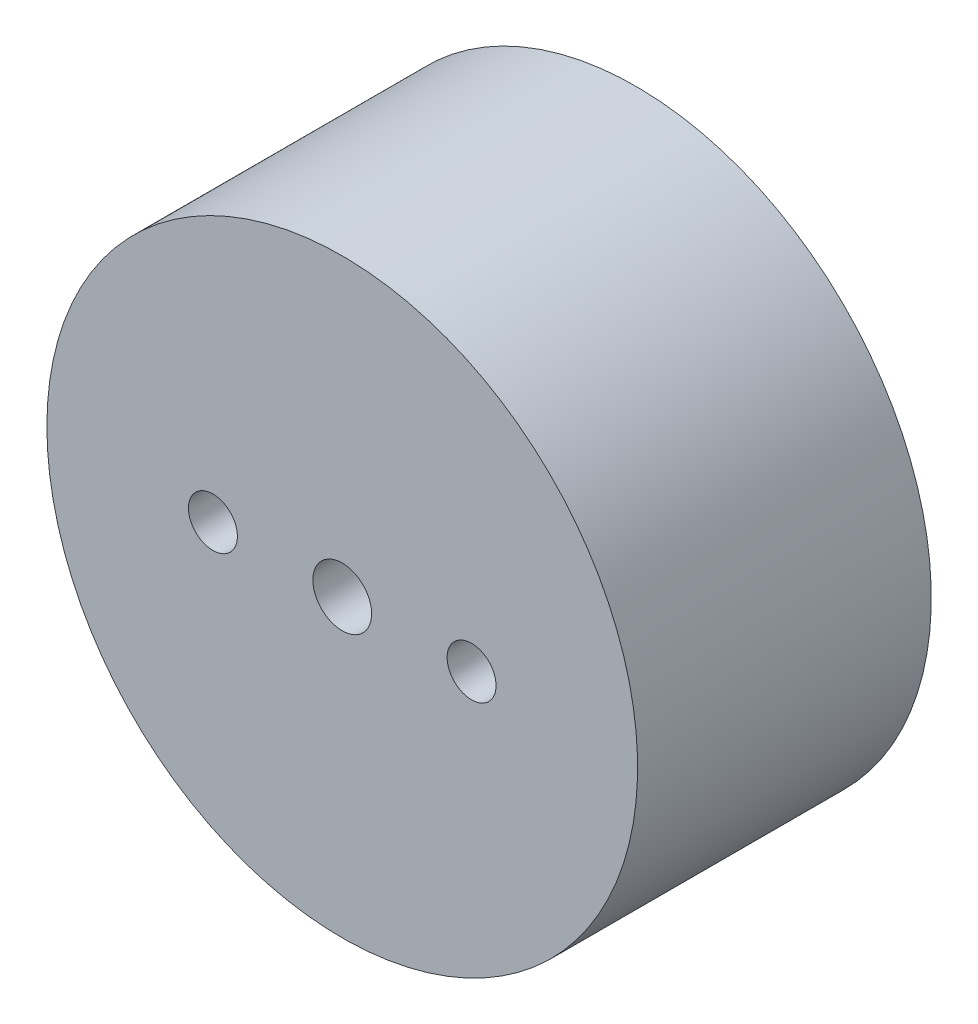
ISO-10303-21;
HEADER;
FILE_DESCRIPTION(('STEP AP214'),'2;1');
FILE_NAME('part.step','',(''),(''),'','','');
FILE_SCHEMA(('AUTOMOTIVE_DESIGN { 1 0 10303 214 1 1 1 1 }'));
ENDSEC;
DATA;
#1=APPLICATION_CONTEXT('core data for automotive mechanical design processes');
#2=APPLICATION_PROTOCOL_DEFINITION('international standard','automotive_design',2000,#1);
#3=PRODUCT_CONTEXT('',#1,'mechanical');
#4=PRODUCT('Part','Part','',(#3));
#5=PRODUCT_RELATED_PRODUCT_CATEGORY('part','',(#4));
#6=PRODUCT_DEFINITION_FORMATION('','',#4);
#7=PRODUCT_DEFINITION_CONTEXT('part definition',#1,'design');
#8=PRODUCT_DEFINITION('design','',#6,#7);
#9=PRODUCT_DEFINITION_SHAPE('','',#8);
#10=(LENGTH_UNIT() NAMED_UNIT(*) SI_UNIT(.MILLI.,.METRE.));
#11=(NAMED_UNIT(*) PLANE_ANGLE_UNIT() SI_UNIT($,.RADIAN.));
#12=(NAMED_UNIT(*) SI_UNIT($,.STERADIAN.) SOLID_ANGLE_UNIT());
#13=UNCERTAINTY_MEASURE_WITH_UNIT(LENGTH_MEASURE(1.E-05),#10,'distance_accuracy_value','');
#14=(GEOMETRIC_REPRESENTATION_CONTEXT(3) GLOBAL_UNCERTAINTY_ASSIGNED_CONTEXT((#13)) GLOBAL_UNIT_ASSIGNED_CONTEXT((#10,
#11,#12)) REPRESENTATION_CONTEXT('',''));
#15=CARTESIAN_POINT('',(0.,0.,0.));
#16=DIRECTION('',(0.,0.,1.));
#17=DIRECTION('',(1.,0.,0.));
#18=AXIS2_PLACEMENT_3D('',#15,#16,#17);
#19=CARTESIAN_POINT('',(0.,0.,-5.08));
#20=DIRECTION('',(0.,0.,1.));
#21=DIRECTION('',(1.,0.,0.));
#22=AXIS2_PLACEMENT_3D('',#19,#20,#21);
#23=PLANE('',#22);
#24=CARTESIAN_POINT('',(8.7249,0.,-5.08));
#25=DIRECTION('',(0.,0.,1.));
#26=DIRECTION('',(1.,0.,0.));
#27=AXIS2_PLACEMENT_3D('',#24,#25,#26);
#28=CIRCLE('',#27,1.651);
#29=CARTESIAN_POINT('',(10.3759,0.,-5.08));
#30=VERTEX_POINT('',#29);
#31=EDGE_CURVE('E40',#30,#30,#28,.T.);
#32=ORIENTED_EDGE('',*,*,#31,.T.);
#33=EDGE_LOOP('',(#32));
#34=FACE_BOUND('',#33,.T.);
#35=CARTESIAN_POINT('',(-8.7249,0.,-5.08));
#36=DIRECTION('',(0.,0.,1.));
#37=DIRECTION('',(1.,0.,0.));
#38=AXIS2_PLACEMENT_3D('',#35,#36,#37);
#39=CIRCLE('',#38,1.651);
#40=CARTESIAN_POINT('',(-7.0739,0.,-5.08));
#41=VERTEX_POINT('',#40);
#42=EDGE_CURVE('E43',#41,#41,#39,.T.);
#43=ORIENTED_EDGE('',*,*,#42,.T.);
#44=EDGE_LOOP('',(#43));
#45=FACE_BOUND('',#44,.T.);
#46=CARTESIAN_POINT('',(0.,0.,-5.08));
#47=DIRECTION('',(0.,0.,1.));
#48=DIRECTION('',(1.,0.,0.));
#49=AXIS2_PLACEMENT_3D('',#46,#47,#48);
#50=CIRCLE('',#49,1.9812);
#51=CARTESIAN_POINT('',(1.9812,0.,-5.08));
#52=VERTEX_POINT('',#51);
#53=EDGE_CURVE('E45',#52,#52,#50,.T.);
#54=ORIENTED_EDGE('',*,*,#53,.T.);
#55=EDGE_LOOP('',(#54));
#56=FACE_BOUND('',#55,.T.);
#57=CARTESIAN_POINT('',(0.,0.,-5.08));
#58=DIRECTION('',(0.,0.,-1.));
#59=DIRECTION('',(-1.,0.,0.));
#60=AXIS2_PLACEMENT_3D('',#57,#58,#59);
#61=CIRCLE('',#60,18.9455130456292);
#62=CARTESIAN_POINT('',(-18.9455130456292,0.,-5.08));
#63=VERTEX_POINT('',#62);
#64=EDGE_CURVE('E17',#63,#63,#61,.T.);
#65=ORIENTED_EDGE('',*,*,#64,.T.);
#66=EDGE_LOOP('',(#65));
#67=FACE_BOUND('',#66,.T.);
#68=ADVANCED_FACE('F14',(#34,#45,#56,#67),#23,.F.);
#69=CARTESIAN_POINT('',(0.,0.,-5.08));
#70=DIRECTION('',(0.,0.,-1.));
#71=DIRECTION('',(-1.,0.,0.));
#72=AXIS2_PLACEMENT_3D('',#69,#70,#71);
#73=CYLINDRICAL_SURFACE('',#72,18.9455130456292);
#74=ORIENTED_EDGE('',*,*,#64,.F.);
#75=EDGE_LOOP('',(#74));
#76=FACE_BOUND('',#75,.T.);
#77=CARTESIAN_POINT('',(0.,0.,-19.812));
#78=DIRECTION('',(0.,0.,-1.));
#79=DIRECTION('',(-1.,0.,0.));
#80=AXIS2_PLACEMENT_3D('',#77,#78,#79);
#81=CIRCLE('',#80,18.9455130456292);
#82=CARTESIAN_POINT('',(-18.9455130456292,0.,-19.812));
#83=VERTEX_POINT('',#82);
#84=EDGE_CURVE('E37',#83,#83,#81,.T.);
#85=ORIENTED_EDGE('',*,*,#84,.T.);
#86=EDGE_LOOP('',(#85));
#87=FACE_BOUND('',#86,.T.);
#88=ADVANCED_FACE('F53',(#76,#87),#73,.F.);
#89=CARTESIAN_POINT('',(0.,0.,-56.5885664557779));
#90=DIRECTION('',(0.,0.,1.));
#91=DIRECTION('',(1.,0.,0.));
#92=AXIS2_PLACEMENT_3D('',#89,#90,#91);
#93=CYLINDRICAL_SURFACE('',#92,1.9812);
#94=CARTESIAN_POINT('',(0.,0.,0.));
#95=DIRECTION('',(0.,0.,1.));
#96=DIRECTION('',(1.,0.,0.));
#97=AXIS2_PLACEMENT_3D('',#94,#95,#96);
#98=CIRCLE('',#97,1.9812);
#99=CARTESIAN_POINT('',(1.9812,0.,0.));
#100=VERTEX_POINT('',#99);
#101=EDGE_CURVE('E34',#100,#100,#98,.F.);
#102=ORIENTED_EDGE('',*,*,#101,.F.);
#103=EDGE_LOOP('',(#102));
#104=FACE_BOUND('',#103,.T.);
#105=ORIENTED_EDGE('',*,*,#53,.F.);
#106=EDGE_LOOP('',(#105));
#107=FACE_BOUND('',#106,.T.);
#108=ADVANCED_FACE('F56',(#104,#107),#93,.F.);
#109=CARTESIAN_POINT('',(-8.7249,0.,-56.5885664557779));
#110=DIRECTION('',(0.,0.,1.));
#111=DIRECTION('',(1.,0.,0.));
#112=AXIS2_PLACEMENT_3D('',#109,#110,#111);
#113=CYLINDRICAL_SURFACE('',#112,1.651);
#114=CARTESIAN_POINT('',(-8.7249,0.,0.));
#115=DIRECTION('',(0.,0.,1.));
#116=DIRECTION('',(1.,0.,0.));
#117=AXIS2_PLACEMENT_3D('',#114,#115,#116);
#118=CIRCLE('',#117,1.651);
#119=CARTESIAN_POINT('',(-7.0739,0.,0.));
#120=VERTEX_POINT('',#119);
#121=EDGE_CURVE('E31',#120,#120,#118,.F.);
#122=ORIENTED_EDGE('',*,*,#121,.F.);
#123=EDGE_LOOP('',(#122));
#124=FACE_BOUND('',#123,.T.);
#125=ORIENTED_EDGE('',*,*,#42,.F.);
#126=EDGE_LOOP('',(#125));
#127=FACE_BOUND('',#126,.T.);
#128=ADVANCED_FACE('F79',(#124,#127),#113,.F.);
#129=CARTESIAN_POINT('',(8.7249,0.,-56.5885664557779));
#130=DIRECTION('',(0.,0.,1.));
#131=DIRECTION('',(1.,0.,0.));
#132=AXIS2_PLACEMENT_3D('',#129,#130,#131);
#133=CYLINDRICAL_SURFACE('',#132,1.651);
#134=CARTESIAN_POINT('',(8.7249,0.,0.));
#135=DIRECTION('',(0.,0.,1.));
#136=DIRECTION('',(1.,0.,0.));
#137=AXIS2_PLACEMENT_3D('',#134,#135,#136);
#138=CIRCLE('',#137,1.651);
#139=CARTESIAN_POINT('',(10.3759,0.,0.));
#140=VERTEX_POINT('',#139);
#141=EDGE_CURVE('E26',#140,#140,#138,.F.);
#142=ORIENTED_EDGE('',*,*,#141,.F.);
#143=EDGE_LOOP('',(#142));
#144=FACE_BOUND('',#143,.T.);
#145=ORIENTED_EDGE('',*,*,#31,.F.);
#146=EDGE_LOOP('',(#145));
#147=FACE_BOUND('',#146,.T.);
#148=ADVANCED_FACE('F63',(#144,#147),#133,.F.);
#149=CARTESIAN_POINT('',(0.,0.,-19.812));
#150=DIRECTION('',(0.,0.,1.));
#151=DIRECTION('',(1.,0.,0.));
#152=AXIS2_PLACEMENT_3D('',#149,#150,#151);
#153=PLANE('',#152);
#154=ORIENTED_EDGE('',*,*,#84,.F.);
#155=EDGE_LOOP('',(#154));
#156=FACE_BOUND('',#155,.T.);
#157=CARTESIAN_POINT('',(0.,0.,-19.812));
#158=DIRECTION('',(0.,0.,-1.));
#159=DIRECTION('',(-1.,0.,0.));
#160=AXIS2_PLACEMENT_3D('',#157,#158,#159);
#161=CIRCLE('',#160,19.9263);
#162=CARTESIAN_POINT('',(-19.9263,0.,-19.812));
#163=VERTEX_POINT('',#162);
#164=EDGE_CURVE('E21',#163,#163,#161,.F.);
#165=ORIENTED_EDGE('',*,*,#164,.F.);
#166=EDGE_LOOP('',(#165));
#167=FACE_BOUND('',#166,.T.);
#168=ADVANCED_FACE('F59',(#156,#167),#153,.F.);
#169=CARTESIAN_POINT('',(0.,0.,0.));
#170=DIRECTION('',(0.,0.,1.));
#171=DIRECTION('',(1.,0.,0.));
#172=AXIS2_PLACEMENT_3D('',#169,#170,#171);
#173=PLANE('',#172);
#174=ORIENTED_EDGE('',*,*,#141,.T.);
#175=EDGE_LOOP('',(#174));
#176=FACE_BOUND('',#175,.T.);
#177=ORIENTED_EDGE('',*,*,#121,.T.);
#178=EDGE_LOOP('',(#177));
#179=FACE_BOUND('',#178,.T.);
#180=ORIENTED_EDGE('',*,*,#101,.T.);
#181=EDGE_LOOP('',(#180));
#182=FACE_BOUND('',#181,.T.);
#183=CARTESIAN_POINT('',(0.,0.,0.));
#184=DIRECTION('',(0.,0.,-1.));
#185=DIRECTION('',(-1.,0.,0.));
#186=AXIS2_PLACEMENT_3D('',#183,#184,#185);
#187=CIRCLE('',#186,19.9263);
#188=CARTESIAN_POINT('',(-19.9263,0.,0.));
#189=VERTEX_POINT('',#188);
#190=EDGE_CURVE('E10',#189,#189,#187,.T.);
#191=ORIENTED_EDGE('',*,*,#190,.F.);
#192=EDGE_LOOP('',(#191));
#193=FACE_BOUND('',#192,.T.);
#194=ADVANCED_FACE('F62',(#176,#179,#182,#193),#173,.T.);
#195=CARTESIAN_POINT('',(0.,0.,0.));
#196=DIRECTION('',(0.,0.,-1.));
#197=DIRECTION('',(-1.,0.,0.));
#198=AXIS2_PLACEMENT_3D('',#195,#196,#197);
#199=CYLINDRICAL_SURFACE('',#198,19.9263);
#200=ORIENTED_EDGE('',*,*,#190,.T.);
#201=EDGE_LOOP('',(#200));
#202=FACE_BOUND('',#201,.T.);
#203=ORIENTED_EDGE('',*,*,#164,.T.);
#204=EDGE_LOOP('',(#203));
#205=FACE_BOUND('',#204,.T.);
#206=ADVANCED_FACE('F67',(#202,#205),#199,.T.);
#207=CLOSED_SHELL('',(#68,#88,#108,#128,#148,#168,#194,#206));
#208=MANIFOLD_SOLID_BREP('B1',#207);
#209=ADVANCED_BREP_SHAPE_REPRESENTATION('',(#18,#208),#14);
#210=SHAPE_DEFINITION_REPRESENTATION(#9,#209);
ENDSEC;
END-ISO-10303-21;
